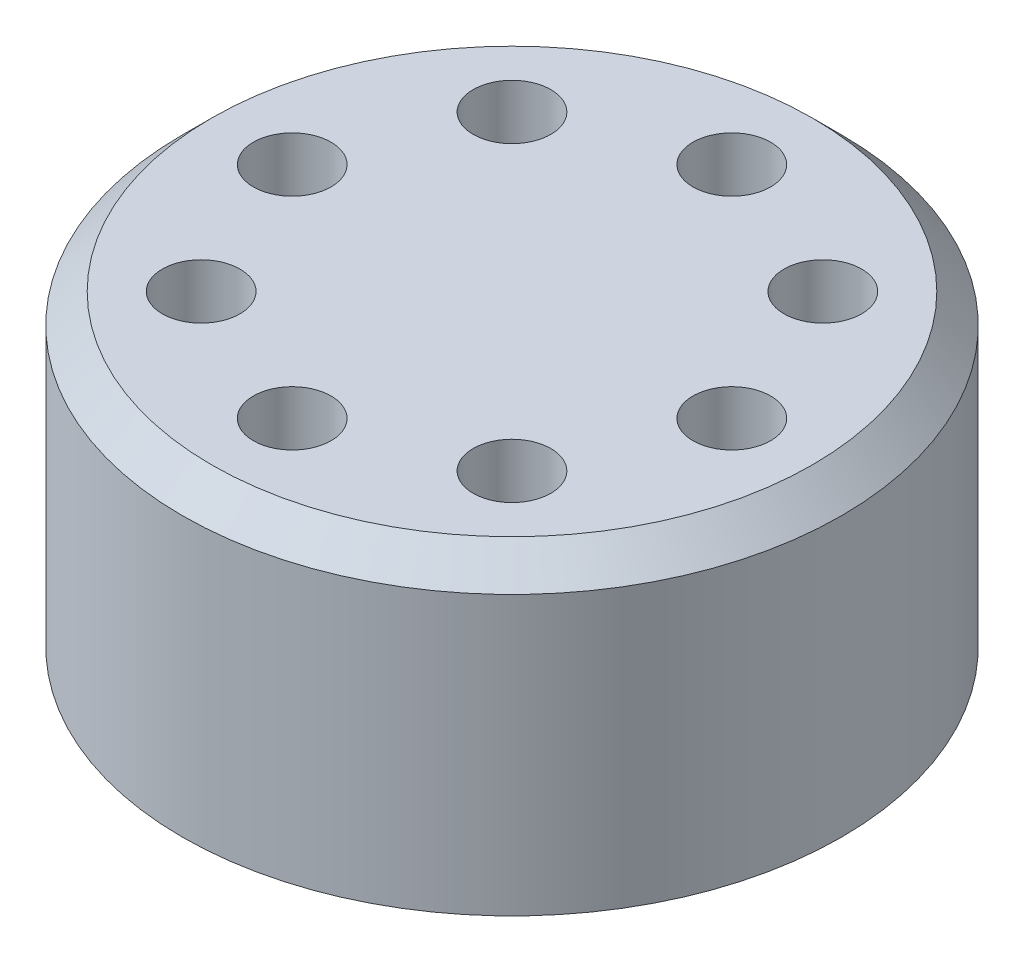
ISO-10303-21;
HEADER;
FILE_DESCRIPTION(('STEP AP214'),'2;1');
FILE_NAME('part.step','',(''),(''),'','','');
FILE_SCHEMA(('AUTOMOTIVE_DESIGN { 1 0 10303 214 1 1 1 1 }'));
ENDSEC;
DATA;
#1=APPLICATION_CONTEXT('core data for automotive mechanical design processes');
#2=APPLICATION_PROTOCOL_DEFINITION('international standard','automotive_design',2000,#1);
#3=PRODUCT_CONTEXT('',#1,'mechanical');
#4=PRODUCT('Part','Part','',(#3));
#5=PRODUCT_RELATED_PRODUCT_CATEGORY('part','',(#4));
#6=PRODUCT_DEFINITION_FORMATION('','',#4);
#7=PRODUCT_DEFINITION_CONTEXT('part definition',#1,'design');
#8=PRODUCT_DEFINITION('design','',#6,#7);
#9=PRODUCT_DEFINITION_SHAPE('','',#8);
#10=(LENGTH_UNIT() NAMED_UNIT(*) SI_UNIT(.MILLI.,.METRE.));
#11=(NAMED_UNIT(*) PLANE_ANGLE_UNIT() SI_UNIT($,.RADIAN.));
#12=(NAMED_UNIT(*) SI_UNIT($,.STERADIAN.) SOLID_ANGLE_UNIT());
#13=UNCERTAINTY_MEASURE_WITH_UNIT(LENGTH_MEASURE(1.E-05),#10,'distance_accuracy_value','');
#14=(GEOMETRIC_REPRESENTATION_CONTEXT(3) GLOBAL_UNCERTAINTY_ASSIGNED_CONTEXT((#13)) GLOBAL_UNIT_ASSIGNED_CONTEXT((#10,
#11,#12)) REPRESENTATION_CONTEXT('',''));
#15=CARTESIAN_POINT('',(0.,0.,0.));
#16=DIRECTION('',(0.,0.,1.));
#17=DIRECTION('',(1.,0.,0.));
#18=AXIS2_PLACEMENT_3D('',#15,#16,#17);
#19=CARTESIAN_POINT('',(0.,21.,0.));
#20=DIRECTION('',(0.,-1.,0.));
#21=DIRECTION('',(0.,0.,-1.));
#22=AXIS2_PLACEMENT_3D('',#19,#20,#21);
#23=CYLINDRICAL_SURFACE('',#22,22.5);
#24=CARTESIAN_POINT('',(0.,19.,0.));
#25=DIRECTION('',(0.,1.,0.));
#26=DIRECTION('',(0.,0.,1.));
#27=AXIS2_PLACEMENT_3D('',#24,#25,#26);
#28=CIRCLE('',#27,22.5);
#29=CARTESIAN_POINT('',(0.,19.,-22.5));
#30=VERTEX_POINT('',#29);
#31=EDGE_CURVE('E10',#30,#30,#28,.F.);
#32=CARTESIAN_POINT('',(0.,0.,0.));
#33=DIRECTION('',(0.,1.,0.));
#34=DIRECTION('',(0.,0.,1.));
#35=AXIS2_PLACEMENT_3D('',#32,#33,#34);
#36=CIRCLE('',#35,22.5);
#37=CARTESIAN_POINT('',(0.,0.,-22.5));
#38=VERTEX_POINT('',#37);
#39=EDGE_CURVE('E51',#38,#38,#36,.T.);
#40=CARTESIAN_POINT('',(0.,19.,-22.5));
#41=CARTESIAN_POINT('',(0.,18.8020833333334,-22.5));
#42=CARTESIAN_POINT('',(0.,18.6041666666667,-22.5));
#43=CARTESIAN_POINT('',(0.,18.2083333333334,-22.5));
#44=CARTESIAN_POINT('',(0.,18.0104166666667,-22.5));
#45=CARTESIAN_POINT('',(0.,17.6145833333334,-22.5));
#46=CARTESIAN_POINT('',(0.,17.4166666666667,-22.5));
#47=CARTESIAN_POINT('',(0.,17.0208333333334,-22.5));
#48=CARTESIAN_POINT('',(0.,16.8229166666667,-22.5));
#49=CARTESIAN_POINT('',(0.,16.4270833333334,-22.5));
#50=CARTESIAN_POINT('',(0.,16.2291666666667,-22.5));
#51=CARTESIAN_POINT('',(0.,15.8333333333334,-22.5));
#52=CARTESIAN_POINT('',(0.,15.6354166666667,-22.5));
#53=CARTESIAN_POINT('',(0.,15.2395833333333,-22.5));
#54=CARTESIAN_POINT('',(0.,15.0416666666667,-22.5));
#55=CARTESIAN_POINT('',(0.,14.6458333333333,-22.5));
#56=CARTESIAN_POINT('',(0.,14.4479166666667,-22.5));
#57=CARTESIAN_POINT('',(0.,14.0520833333333,-22.5));
#58=CARTESIAN_POINT('',(0.,13.8541666666667,-22.5));
#59=CARTESIAN_POINT('',(0.,13.4583333333333,-22.5));
#60=CARTESIAN_POINT('',(0.,13.2604166666667,-22.5));
#61=CARTESIAN_POINT('',(0.,12.8645833333333,-22.5));
#62=CARTESIAN_POINT('',(0.,12.6666666666667,-22.5));
#63=CARTESIAN_POINT('',(0.,12.2708333333333,-22.5));
#64=CARTESIAN_POINT('',(0.,12.0729166666667,-22.5));
#65=CARTESIAN_POINT('',(0.,11.6770833333333,-22.5));
#66=CARTESIAN_POINT('',(0.,11.4791666666667,-22.5));
#67=CARTESIAN_POINT('',(0.,11.0833333333333,-22.5));
#68=CARTESIAN_POINT('',(0.,10.8854166666667,-22.5));
#69=CARTESIAN_POINT('',(0.,10.4895833333333,-22.5));
#70=CARTESIAN_POINT('',(0.,10.2916666666667,-22.5));
#71=CARTESIAN_POINT('',(0.,9.89583333333334,-22.5));
#72=CARTESIAN_POINT('',(0.,9.69791666666668,-22.5));
#73=CARTESIAN_POINT('',(0.,9.30208333333334,-22.5));
#74=CARTESIAN_POINT('',(0.,9.10416666666668,-22.5));
#75=CARTESIAN_POINT('',(0.,8.70833333333334,-22.5));
#76=CARTESIAN_POINT('',(0.,8.51041666666668,-22.5));
#77=CARTESIAN_POINT('',(0.,8.11458333333334,-22.5));
#78=CARTESIAN_POINT('',(0.,7.91666666666668,-22.5));
#79=CARTESIAN_POINT('',(0.,7.52083333333334,-22.5));
#80=CARTESIAN_POINT('',(0.,7.32291666666667,-22.5));
#81=CARTESIAN_POINT('',(0.,6.92708333333334,-22.5));
#82=CARTESIAN_POINT('',(0.,6.72916666666667,-22.5));
#83=CARTESIAN_POINT('',(0.,6.33333333333334,-22.5));
#84=CARTESIAN_POINT('',(0.,6.13541666666667,-22.5));
#85=CARTESIAN_POINT('',(0.,5.73958333333334,-22.5));
#86=CARTESIAN_POINT('',(0.,5.54166666666667,-22.5));
#87=CARTESIAN_POINT('',(0.,5.14583333333334,-22.5));
#88=CARTESIAN_POINT('',(0.,4.94791666666667,-22.5));
#89=CARTESIAN_POINT('',(0.,4.55208333333334,-22.5));
#90=CARTESIAN_POINT('',(0.,4.35416666666667,-22.5));
#91=CARTESIAN_POINT('',(0.,3.95833333333334,-22.5));
#92=CARTESIAN_POINT('',(0.,3.76041666666667,-22.5));
#93=CARTESIAN_POINT('',(0.,3.36458333333334,-22.5));
#94=CARTESIAN_POINT('',(0.,3.16666666666667,-22.5));
#95=CARTESIAN_POINT('',(0.,2.77083333333334,-22.5));
#96=CARTESIAN_POINT('',(0.,2.57291666666667,-22.5));
#97=CARTESIAN_POINT('',(0.,2.17708333333334,-22.5));
#98=CARTESIAN_POINT('',(0.,1.97916666666667,-22.5));
#99=CARTESIAN_POINT('',(0.,1.58333333333333,-22.5));
#100=CARTESIAN_POINT('',(0.,1.38541666666667,-22.5));
#101=CARTESIAN_POINT('',(0.,0.989583333333334,-22.5));
#102=CARTESIAN_POINT('',(0.,0.791666666666667,-22.5));
#103=CARTESIAN_POINT('',(0.,0.395833333333334,-22.5));
#104=CARTESIAN_POINT('',(0.,0.197916666666667,-22.5));
#105=CARTESIAN_POINT('',(0.,0.,-22.5));
#106=B_SPLINE_CURVE_WITH_KNOTS('',3,(#40,#41,#42,#43,#44,#45,#46,#47,#48,#49,#50,#51,#52,#53,
#54,#55,#56,#57,#58,#59,#60,#61,#62,#63,#64,#65,#66,#67,#68,#69,#70,#71,#72,#73,#74,#75,#76,#77,
#78,#79,#80,#81,#82,#83,#84,#85,#86,#87,#88,#89,#90,#91,#92,#93,#94,#95,#96,#97,#98,#99,#100,
#101,#102,#103,#104,#105),.UNSPECIFIED.,.F.,.F.,(4,2,2,2,2,2,2,2,2,2,2,2,2,2,2,2,2,2,2,2,2,2,2,
2,2,2,2,2,2,2,2,2,4),(0.,0.593750000000001,1.1875,1.78125,2.375,2.96875,3.5625,4.15625,4.75,
5.34375,5.9375,6.53125000000001,7.12500000000001,7.71875000000001,8.31250000000001,
8.90625000000001,9.50000000000001,10.09375,10.6875,11.28125,11.875,12.46875,13.0625,13.65625,
14.25,14.84375,15.4375,16.03125,16.625,17.21875,17.8125,18.40625,19.),.UNSPECIFIED.);
#107=EDGE_CURVE('BSEAM39',#30,#38,#106,.T.);
#108=ORIENTED_EDGE('',*,*,#31,.T.);
#109=ORIENTED_EDGE('',*,*,#39,.T.);
#110=ORIENTED_EDGE('',*,*,#107,.T.);
#111=ORIENTED_EDGE('',*,*,#107,.F.);
#112=EDGE_LOOP('',(#108,#110,#109,#111));
#113=FACE_BOUND('',#112,.T.);
#114=ADVANCED_FACE('F39',(#113),#23,.T.);
#115=CARTESIAN_POINT('',(0.,21.,0.));
#116=DIRECTION('',(0.,1.,0.));
#117=DIRECTION('',(0.,0.,1.));
#118=AXIS2_PLACEMENT_3D('',#115,#116,#117);
#119=PLANE('',#118);
#120=CARTESIAN_POINT('',(0.,21.,-15.));
#121=DIRECTION('',(0.,1.,0.));
#122=DIRECTION('',(0.,0.,1.));
#123=AXIS2_PLACEMENT_3D('',#120,#121,#122);
#124=CIRCLE('',#123,2.65);
#125=CARTESIAN_POINT('',(0.,21.,-12.35));
#126=VERTEX_POINT('',#125);
#127=EDGE_CURVE('E102',#126,#126,#124,.T.);
#128=ORIENTED_EDGE('',*,*,#127,.F.);
#129=EDGE_LOOP('',(#128));
#130=FACE_BOUND('',#129,.T.);
#131=CARTESIAN_POINT('',(15.,21.,0.));
#132=DIRECTION('',(0.,1.,0.));
#133=DIRECTION('',(0.,0.,1.));
#134=AXIS2_PLACEMENT_3D('',#131,#132,#133);
#135=CIRCLE('',#134,2.65);
#136=CARTESIAN_POINT('',(15.,21.,2.65));
#137=VERTEX_POINT('',#136);
#138=EDGE_CURVE('E96',#137,#137,#135,.T.);
#139=ORIENTED_EDGE('',*,*,#138,.F.);
#140=EDGE_LOOP('',(#139));
#141=FACE_BOUND('',#140,.T.);
#142=CARTESIAN_POINT('',(0.,21.,15.));
#143=DIRECTION('',(0.,1.,0.));
#144=DIRECTION('',(0.,0.,1.));
#145=AXIS2_PLACEMENT_3D('',#142,#143,#144);
#146=CIRCLE('',#145,2.65);
#147=CARTESIAN_POINT('',(0.,21.,17.65));
#148=VERTEX_POINT('',#147);
#149=EDGE_CURVE('E90',#148,#148,#146,.T.);
#150=ORIENTED_EDGE('',*,*,#149,.F.);
#151=EDGE_LOOP('',(#150));
#152=FACE_BOUND('',#151,.T.);
#153=CARTESIAN_POINT('',(-15.,21.,0.));
#154=DIRECTION('',(0.,1.,0.));
#155=DIRECTION('',(0.,0.,1.));
#156=AXIS2_PLACEMENT_3D('',#153,#154,#155);
#157=CIRCLE('',#156,2.65);
#158=CARTESIAN_POINT('',(-15.,21.,2.65));
#159=VERTEX_POINT('',#158);
#160=EDGE_CURVE('E84',#159,#159,#157,.T.);
#161=ORIENTED_EDGE('',*,*,#160,.F.);
#162=EDGE_LOOP('',(#161));
#163=FACE_BOUND('',#162,.T.);
#164=CARTESIAN_POINT('',(10.6066017177982,21.,-10.6066017177982));
#165=DIRECTION('',(0.,1.,0.));
#166=DIRECTION('',(0.,0.,1.));
#167=AXIS2_PLACEMENT_3D('',#164,#165,#166);
#168=CIRCLE('',#167,2.65);
#169=CARTESIAN_POINT('',(10.6066017177982,21.,-7.95660171779821));
#170=VERTEX_POINT('',#169);
#171=EDGE_CURVE('E78',#170,#170,#168,.T.);
#172=ORIENTED_EDGE('',*,*,#171,.F.);
#173=EDGE_LOOP('',(#172));
#174=FACE_BOUND('',#173,.T.);
#175=CARTESIAN_POINT('',(10.6066017177982,21.,10.6066017177982));
#176=DIRECTION('',(0.,1.,0.));
#177=DIRECTION('',(0.,0.,1.));
#178=AXIS2_PLACEMENT_3D('',#175,#176,#177);
#179=CIRCLE('',#178,2.65);
#180=CARTESIAN_POINT('',(10.6066017177982,21.,13.2566017177982));
#181=VERTEX_POINT('',#180);
#182=EDGE_CURVE('E72',#181,#181,#179,.T.);
#183=ORIENTED_EDGE('',*,*,#182,.F.);
#184=EDGE_LOOP('',(#183));
#185=FACE_BOUND('',#184,.T.);
#186=CARTESIAN_POINT('',(-10.6066017177982,21.,10.6066017177982));
#187=DIRECTION('',(0.,1.,0.));
#188=DIRECTION('',(0.,0.,1.));
#189=AXIS2_PLACEMENT_3D('',#186,#187,#188);
#190=CIRCLE('',#189,2.65);
#191=CARTESIAN_POINT('',(-10.6066017177982,21.,13.2566017177982));
#192=VERTEX_POINT('',#191);
#193=EDGE_CURVE('E66',#192,#192,#190,.T.);
#194=ORIENTED_EDGE('',*,*,#193,.F.);
#195=EDGE_LOOP('',(#194));
#196=FACE_BOUND('',#195,.T.);
#197=CARTESIAN_POINT('',(-10.6066017177982,21.,-10.6066017177982));
#198=DIRECTION('',(0.,1.,0.));
#199=DIRECTION('',(0.,0.,1.));
#200=AXIS2_PLACEMENT_3D('',#197,#198,#199);
#201=CIRCLE('',#200,2.65);
#202=CARTESIAN_POINT('',(-10.6066017177982,21.,-7.95660171779822));
#203=VERTEX_POINT('',#202);
#204=EDGE_CURVE('E60',#203,#203,#201,.T.);
#205=ORIENTED_EDGE('',*,*,#204,.F.);
#206=EDGE_LOOP('',(#205));
#207=FACE_BOUND('',#206,.T.);
#208=CARTESIAN_POINT('',(0.,21.,0.));
#209=DIRECTION('',(0.,1.,0.));
#210=DIRECTION('',(0.,0.,1.));
#211=AXIS2_PLACEMENT_3D('',#208,#209,#210);
#212=CIRCLE('',#211,20.5);
#213=CARTESIAN_POINT('',(0.,21.,20.5));
#214=VERTEX_POINT('',#213);
#215=EDGE_CURVE('E47',#214,#214,#212,.T.);
#216=ORIENTED_EDGE('',*,*,#215,.T.);
#217=EDGE_LOOP('',(#216));
#218=FACE_BOUND('',#217,.T.);
#219=ADVANCED_FACE('F108',(#130,#141,#152,#163,#174,#185,#196,#207,#218),#119,.T.);
#220=CARTESIAN_POINT('',(0.,0.,0.));
#221=DIRECTION('',(0.,1.,0.));
#222=DIRECTION('',(0.,0.,1.));
#223=AXIS2_PLACEMENT_3D('',#220,#221,#222);
#224=PLANE('',#223);
#225=CARTESIAN_POINT('',(0.,0.,-15.));
#226=DIRECTION('',(0.,1.,0.));
#227=DIRECTION('',(0.,0.,1.));
#228=AXIS2_PLACEMENT_3D('',#225,#226,#227);
#229=CIRCLE('',#228,2.65);
#230=CARTESIAN_POINT('',(0.,0.,-12.35));
#231=VERTEX_POINT('',#230);
#232=EDGE_CURVE('E99',#231,#231,#229,.T.);
#233=ORIENTED_EDGE('',*,*,#232,.T.);
#234=EDGE_LOOP('',(#233));
#235=FACE_BOUND('',#234,.T.);
#236=CARTESIAN_POINT('',(15.,0.,0.));
#237=DIRECTION('',(0.,1.,0.));
#238=DIRECTION('',(0.,0.,1.));
#239=AXIS2_PLACEMENT_3D('',#236,#237,#238);
#240=CIRCLE('',#239,2.65);
#241=CARTESIAN_POINT('',(15.,0.,2.65));
#242=VERTEX_POINT('',#241);
#243=EDGE_CURVE('E93',#242,#242,#240,.T.);
#244=ORIENTED_EDGE('',*,*,#243,.T.);
#245=EDGE_LOOP('',(#244));
#246=FACE_BOUND('',#245,.T.);
#247=CARTESIAN_POINT('',(0.,0.,15.));
#248=DIRECTION('',(0.,1.,0.));
#249=DIRECTION('',(0.,0.,1.));
#250=AXIS2_PLACEMENT_3D('',#247,#248,#249);
#251=CIRCLE('',#250,2.65);
#252=CARTESIAN_POINT('',(0.,0.,17.65));
#253=VERTEX_POINT('',#252);
#254=EDGE_CURVE('E87',#253,#253,#251,.T.);
#255=ORIENTED_EDGE('',*,*,#254,.T.);
#256=EDGE_LOOP('',(#255));
#257=FACE_BOUND('',#256,.T.);
#258=CARTESIAN_POINT('',(-15.,0.,0.));
#259=DIRECTION('',(0.,1.,0.));
#260=DIRECTION('',(0.,0.,1.));
#261=AXIS2_PLACEMENT_3D('',#258,#259,#260);
#262=CIRCLE('',#261,2.65);
#263=CARTESIAN_POINT('',(-15.,0.,2.65));
#264=VERTEX_POINT('',#263);
#265=EDGE_CURVE('E81',#264,#264,#262,.T.);
#266=ORIENTED_EDGE('',*,*,#265,.T.);
#267=EDGE_LOOP('',(#266));
#268=FACE_BOUND('',#267,.T.);
#269=CARTESIAN_POINT('',(10.6066017177982,0.,-10.6066017177982));
#270=DIRECTION('',(0.,1.,0.));
#271=DIRECTION('',(0.,0.,1.));
#272=AXIS2_PLACEMENT_3D('',#269,#270,#271);
#273=CIRCLE('',#272,2.65);
#274=CARTESIAN_POINT('',(10.6066017177982,0.,-7.95660171779822));
#275=VERTEX_POINT('',#274);
#276=EDGE_CURVE('E75',#275,#275,#273,.T.);
#277=ORIENTED_EDGE('',*,*,#276,.T.);
#278=EDGE_LOOP('',(#277));
#279=FACE_BOUND('',#278,.T.);
#280=CARTESIAN_POINT('',(10.6066017177982,0.,10.6066017177982));
#281=DIRECTION('',(0.,1.,0.));
#282=DIRECTION('',(0.,0.,1.));
#283=AXIS2_PLACEMENT_3D('',#280,#281,#282);
#284=CIRCLE('',#283,2.65);
#285=CARTESIAN_POINT('',(10.6066017177982,0.,13.2566017177982));
#286=VERTEX_POINT('',#285);
#287=EDGE_CURVE('E69',#286,#286,#284,.T.);
#288=ORIENTED_EDGE('',*,*,#287,.T.);
#289=EDGE_LOOP('',(#288));
#290=FACE_BOUND('',#289,.T.);
#291=CARTESIAN_POINT('',(-10.6066017177982,0.,10.6066017177982));
#292=DIRECTION('',(0.,1.,0.));
#293=DIRECTION('',(0.,0.,1.));
#294=AXIS2_PLACEMENT_3D('',#291,#292,#293);
#295=CIRCLE('',#294,2.65);
#296=CARTESIAN_POINT('',(-10.6066017177982,0.,13.2566017177982));
#297=VERTEX_POINT('',#296);
#298=EDGE_CURVE('E63',#297,#297,#295,.T.);
#299=ORIENTED_EDGE('',*,*,#298,.T.);
#300=EDGE_LOOP('',(#299));
#301=FACE_BOUND('',#300,.T.);
#302=CARTESIAN_POINT('',(-10.6066017177982,0.,-10.6066017177982));
#303=DIRECTION('',(0.,1.,0.));
#304=DIRECTION('',(0.,0.,1.));
#305=AXIS2_PLACEMENT_3D('',#302,#303,#304);
#306=CIRCLE('',#305,2.65);
#307=CARTESIAN_POINT('',(-10.6066017177982,0.,-7.95660171779822));
#308=VERTEX_POINT('',#307);
#309=EDGE_CURVE('E55',#308,#308,#306,.T.);
#310=ORIENTED_EDGE('',*,*,#309,.T.);
#311=EDGE_LOOP('',(#310));
#312=FACE_BOUND('',#311,.T.);
#313=ORIENTED_EDGE('',*,*,#39,.F.);
#314=EDGE_LOOP('',(#313));
#315=FACE_BOUND('',#314,.T.);
#316=ADVANCED_FACE('F111',(#235,#246,#257,#268,#279,#290,#301,#312,#315),#224,.F.);
#317=CARTESIAN_POINT('',(0.,21.,0.));
#318=DIRECTION('',(0.,-1.,0.));
#319=DIRECTION('',(0.,0.,-1.));
#320=AXIS2_PLACEMENT_3D('',#317,#318,#319);
#321=CONICAL_SURFACE('',#320,20.5,0.785398163397447);
#322=ORIENTED_EDGE('',*,*,#31,.F.);
#323=EDGE_LOOP('',(#322));
#324=FACE_BOUND('',#323,.T.);
#325=ORIENTED_EDGE('',*,*,#215,.F.);
#326=EDGE_LOOP('',(#325));
#327=FACE_BOUND('',#326,.T.);
#328=ADVANCED_FACE('F42',(#324,#327),#321,.T.);
#329=CARTESIAN_POINT('',(-10.6066017177982,21.,-10.6066017177982));
#330=DIRECTION('',(0.,1.,0.));
#331=DIRECTION('',(0.,0.,1.));
#332=AXIS2_PLACEMENT_3D('',#329,#330,#331);
#333=CYLINDRICAL_SURFACE('',#332,2.65);
#334=ORIENTED_EDGE('',*,*,#309,.F.);
#335=EDGE_LOOP('',(#334));
#336=FACE_BOUND('',#335,.T.);
#337=ORIENTED_EDGE('',*,*,#204,.T.);
#338=EDGE_LOOP('',(#337));
#339=FACE_BOUND('',#338,.T.);
#340=ADVANCED_FACE('F127',(#336,#339),#333,.F.);
#341=CARTESIAN_POINT('',(-10.6066017177982,21.,10.6066017177982));
#342=DIRECTION('',(0.,1.,0.));
#343=DIRECTION('',(0.,0.,1.));
#344=AXIS2_PLACEMENT_3D('',#341,#342,#343);
#345=CYLINDRICAL_SURFACE('',#344,2.65);
#346=ORIENTED_EDGE('',*,*,#298,.F.);
#347=EDGE_LOOP('',(#346));
#348=FACE_BOUND('',#347,.T.);
#349=ORIENTED_EDGE('',*,*,#193,.T.);
#350=EDGE_LOOP('',(#349));
#351=FACE_BOUND('',#350,.T.);
#352=ADVANCED_FACE('F129',(#348,#351),#345,.F.);
#353=CARTESIAN_POINT('',(10.6066017177982,21.,10.6066017177982));
#354=DIRECTION('',(0.,1.,0.));
#355=DIRECTION('',(0.,0.,1.));
#356=AXIS2_PLACEMENT_3D('',#353,#354,#355);
#357=CYLINDRICAL_SURFACE('',#356,2.65);
#358=ORIENTED_EDGE('',*,*,#287,.F.);
#359=EDGE_LOOP('',(#358));
#360=FACE_BOUND('',#359,.T.);
#361=ORIENTED_EDGE('',*,*,#182,.T.);
#362=EDGE_LOOP('',(#361));
#363=FACE_BOUND('',#362,.T.);
#364=ADVANCED_FACE('F136',(#360,#363),#357,.F.);
#365=CARTESIAN_POINT('',(10.6066017177982,21.,-10.6066017177982));
#366=DIRECTION('',(0.,1.,0.));
#367=DIRECTION('',(0.,0.,1.));
#368=AXIS2_PLACEMENT_3D('',#365,#366,#367);
#369=CYLINDRICAL_SURFACE('',#368,2.65);
#370=ORIENTED_EDGE('',*,*,#276,.F.);
#371=EDGE_LOOP('',(#370));
#372=FACE_BOUND('',#371,.T.);
#373=ORIENTED_EDGE('',*,*,#171,.T.);
#374=EDGE_LOOP('',(#373));
#375=FACE_BOUND('',#374,.T.);
#376=ADVANCED_FACE('F172',(#372,#375),#369,.F.);
#377=CARTESIAN_POINT('',(-15.,21.,0.));
#378=DIRECTION('',(0.,1.,0.));
#379=DIRECTION('',(0.,0.,1.));
#380=AXIS2_PLACEMENT_3D('',#377,#378,#379);
#381=CYLINDRICAL_SURFACE('',#380,2.65);
#382=ORIENTED_EDGE('',*,*,#265,.F.);
#383=EDGE_LOOP('',(#382));
#384=FACE_BOUND('',#383,.T.);
#385=ORIENTED_EDGE('',*,*,#160,.T.);
#386=EDGE_LOOP('',(#385));
#387=FACE_BOUND('',#386,.T.);
#388=ADVANCED_FACE('F177',(#384,#387),#381,.F.);
#389=CARTESIAN_POINT('',(0.,21.,15.));
#390=DIRECTION('',(0.,1.,0.));
#391=DIRECTION('',(0.,0.,1.));
#392=AXIS2_PLACEMENT_3D('',#389,#390,#391);
#393=CYLINDRICAL_SURFACE('',#392,2.65);
#394=ORIENTED_EDGE('',*,*,#254,.F.);
#395=EDGE_LOOP('',(#394));
#396=FACE_BOUND('',#395,.T.);
#397=ORIENTED_EDGE('',*,*,#149,.T.);
#398=EDGE_LOOP('',(#397));
#399=FACE_BOUND('',#398,.T.);
#400=ADVANCED_FACE('F183',(#396,#399),#393,.F.);
#401=CARTESIAN_POINT('',(15.,21.,0.));
#402=DIRECTION('',(0.,1.,0.));
#403=DIRECTION('',(0.,0.,1.));
#404=AXIS2_PLACEMENT_3D('',#401,#402,#403);
#405=CYLINDRICAL_SURFACE('',#404,2.65);
#406=ORIENTED_EDGE('',*,*,#243,.F.);
#407=EDGE_LOOP('',(#406));
#408=FACE_BOUND('',#407,.T.);
#409=ORIENTED_EDGE('',*,*,#138,.T.);
#410=EDGE_LOOP('',(#409));
#411=FACE_BOUND('',#410,.T.);
#412=ADVANCED_FACE('F187',(#408,#411),#405,.F.);
#413=CARTESIAN_POINT('',(0.,21.,-15.));
#414=DIRECTION('',(0.,1.,0.));
#415=DIRECTION('',(0.,0.,1.));
#416=AXIS2_PLACEMENT_3D('',#413,#414,#415);
#417=CYLINDRICAL_SURFACE('',#416,2.65);
#418=ORIENTED_EDGE('',*,*,#232,.F.);
#419=EDGE_LOOP('',(#418));
#420=FACE_BOUND('',#419,.T.);
#421=ORIENTED_EDGE('',*,*,#127,.T.);
#422=EDGE_LOOP('',(#421));
#423=FACE_BOUND('',#422,.T.);
#424=ADVANCED_FACE('F106',(#420,#423),#417,.F.);
#425=CLOSED_SHELL('',(#114,#219,#316,#328,#340,#352,#364,#376,#388,#400,#412,#424));
#426=MANIFOLD_SOLID_BREP('B2',#425);
#427=ADVANCED_BREP_SHAPE_REPRESENTATION('',(#18,#426),#14);
#428=SHAPE_DEFINITION_REPRESENTATION(#9,#427);
ENDSEC;
END-ISO-10303-21;
